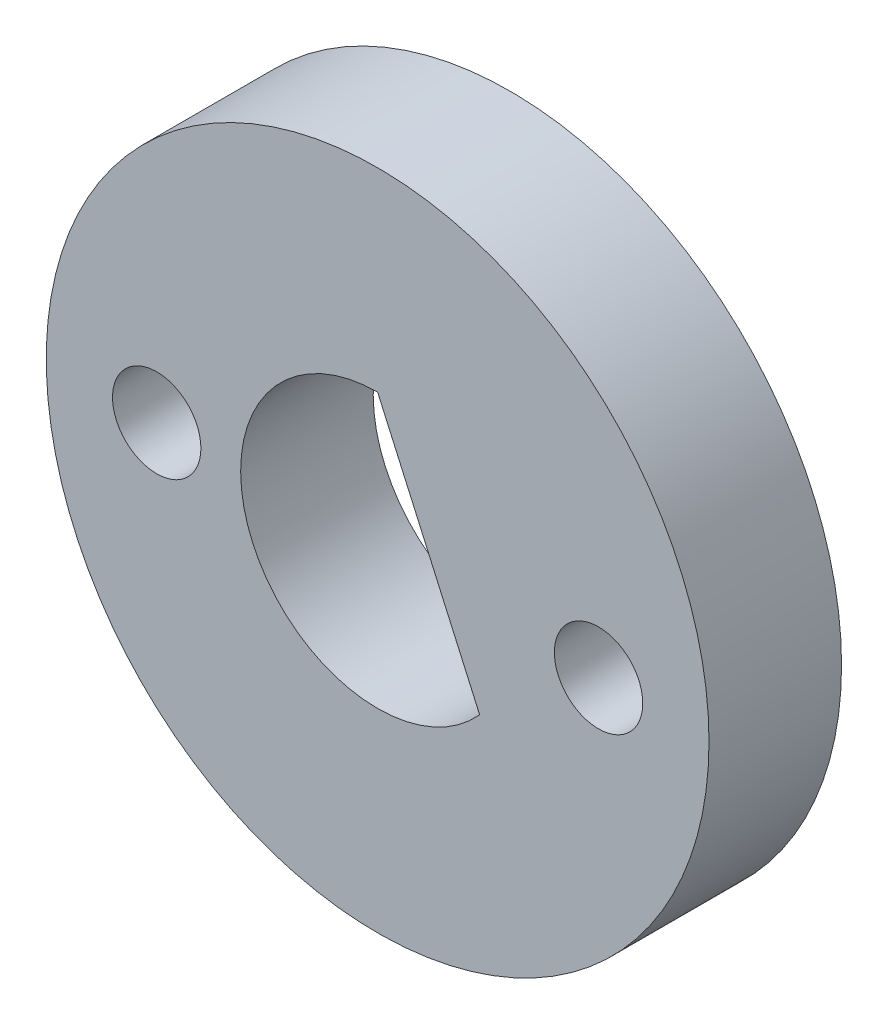
ISO-10303-21;
HEADER;
FILE_DESCRIPTION(('STEP AP214'),'2;1');
FILE_NAME('part.step','',(''),(''),'','','');
FILE_SCHEMA(('AUTOMOTIVE_DESIGN { 1 0 10303 214 1 1 1 1 }'));
ENDSEC;
DATA;
#1=APPLICATION_CONTEXT('core data for automotive mechanical design processes');
#2=APPLICATION_PROTOCOL_DEFINITION('international standard','automotive_design',2000,#1);
#3=PRODUCT_CONTEXT('',#1,'mechanical');
#4=PRODUCT('Part','Part','',(#3));
#5=PRODUCT_RELATED_PRODUCT_CATEGORY('part','',(#4));
#6=PRODUCT_DEFINITION_FORMATION('','',#4);
#7=PRODUCT_DEFINITION_CONTEXT('part definition',#1,'design');
#8=PRODUCT_DEFINITION('design','',#6,#7);
#9=PRODUCT_DEFINITION_SHAPE('','',#8);
#10=(LENGTH_UNIT() NAMED_UNIT(*) SI_UNIT(.MILLI.,.METRE.));
#11=(NAMED_UNIT(*) PLANE_ANGLE_UNIT() SI_UNIT($,.RADIAN.));
#12=(NAMED_UNIT(*) SI_UNIT($,.STERADIAN.) SOLID_ANGLE_UNIT());
#13=UNCERTAINTY_MEASURE_WITH_UNIT(LENGTH_MEASURE(1.E-05),#10,'distance_accuracy_value','');
#14=(GEOMETRIC_REPRESENTATION_CONTEXT(3) GLOBAL_UNCERTAINTY_ASSIGNED_CONTEXT((#13)) GLOBAL_UNIT_ASSIGNED_CONTEXT((#10,
#11,#12)) REPRESENTATION_CONTEXT('',''));
#15=CARTESIAN_POINT('',(0.,0.,0.));
#16=DIRECTION('',(0.,0.,1.));
#17=DIRECTION('',(1.,0.,0.));
#18=AXIS2_PLACEMENT_3D('',#15,#16,#17);
#19=CARTESIAN_POINT('',(0.,0.,3.));
#20=DIRECTION('',(0.,0.,-1.));
#21=DIRECTION('',(-1.,0.,0.));
#22=AXIS2_PLACEMENT_3D('',#19,#20,#21);
#23=CYLINDRICAL_SURFACE('',#22,7.5);
#24=CARTESIAN_POINT('',(0.,0.,3.));
#25=DIRECTION('',(0.,0.,1.));
#26=DIRECTION('',(1.,0.,0.));
#27=AXIS2_PLACEMENT_3D('',#24,#25,#26);
#28=CIRCLE('',#27,7.5);
#29=CARTESIAN_POINT('',(7.5,0.,3.));
#30=VERTEX_POINT('',#29);
#31=EDGE_CURVE('E11',#30,#30,#28,.T.);
#32=ORIENTED_EDGE('',*,*,#31,.F.);
#33=EDGE_LOOP('',(#32));
#34=FACE_BOUND('',#33,.T.);
#35=CARTESIAN_POINT('',(0.,0.,0.));
#36=DIRECTION('',(0.,0.,1.));
#37=DIRECTION('',(1.,0.,0.));
#38=AXIS2_PLACEMENT_3D('',#35,#36,#37);
#39=CIRCLE('',#38,7.5);
#40=CARTESIAN_POINT('',(7.5,0.,0.));
#41=VERTEX_POINT('',#40);
#42=EDGE_CURVE('E36',#41,#41,#39,.T.);
#43=ORIENTED_EDGE('',*,*,#42,.T.);
#44=EDGE_LOOP('',(#43));
#45=FACE_BOUND('',#44,.T.);
#46=ADVANCED_FACE('F33',(#34,#45),#23,.T.);
#47=CARTESIAN_POINT('',(0.,0.,3.));
#48=DIRECTION('',(0.,0.,1.));
#49=DIRECTION('',(1.,0.,0.));
#50=AXIS2_PLACEMENT_3D('',#47,#48,#49);
#51=PLANE('',#50);
#52=CARTESIAN_POINT('',(-5.,0.,3.));
#53=DIRECTION('',(0.,0.,1.));
#54=DIRECTION('',(1.,0.,0.));
#55=AXIS2_PLACEMENT_3D('',#52,#53,#54);
#56=CIRCLE('',#55,0.999999999999989);
#57=CARTESIAN_POINT('',(-4.00000000000001,0.,3.));
#58=VERTEX_POINT('',#57);
#59=EDGE_CURVE('E86',#58,#58,#56,.T.);
#60=ORIENTED_EDGE('',*,*,#59,.F.);
#61=EDGE_LOOP('',(#60));
#62=FACE_BOUND('',#61,.T.);
#63=CARTESIAN_POINT('',(5.,0.,3.));
#64=DIRECTION('',(0.,0.,1.));
#65=DIRECTION('',(1.,0.,0.));
#66=AXIS2_PLACEMENT_3D('',#63,#64,#65);
#67=CIRCLE('',#66,0.999999999999989);
#68=CARTESIAN_POINT('',(5.99999999999999,0.,3.));
#69=VERTEX_POINT('',#68);
#70=EDGE_CURVE('E75',#69,#69,#67,.T.);
#71=ORIENTED_EDGE('',*,*,#70,.F.);
#72=EDGE_LOOP('',(#71));
#73=FACE_BOUND('',#72,.T.);
#74=CARTESIAN_POINT('',(0.,0.,3.));
#75=DIRECTION('',(0.,0.,1.));
#76=DIRECTION('',(1.,0.,0.));
#77=AXIS2_PLACEMENT_3D('',#74,#75,#76);
#78=CIRCLE('',#77,3.1);
#79=CARTESIAN_POINT('',(0.,3.1,3.));
#80=VERTEX_POINT('',#79);
#81=CARTESIAN_POINT('',(2.30885494113047,-2.06862003780718,3.));
#82=VERTEX_POINT('',#81);
#83=EDGE_CURVE('E47',#80,#82,#78,.T.);
#84=ORIENTED_EDGE('',*,*,#83,.F.);
#85=DIRECTION('',(-0.407862239984646,0.91304347826087,0.));
#86=VECTOR('',#85,1.);
#87=CARTESIAN_POINT('',(0.,3.1,3.));
#88=LINE('',#87,#86);
#89=EDGE_CURVE('E66',#82,#80,#88,.T.);
#90=ORIENTED_EDGE('',*,*,#89,.F.);
#91=EDGE_LOOP('',(#84,#90));
#92=FACE_BOUND('',#91,.T.);
#93=ORIENTED_EDGE('',*,*,#31,.T.);
#94=EDGE_LOOP('',(#93));
#95=FACE_BOUND('',#94,.T.);
#96=ADVANCED_FACE('F70',(#62,#73,#92,#95),#51,.T.);
#97=CARTESIAN_POINT('',(0.,0.,0.));
#98=DIRECTION('',(0.,0.,1.));
#99=DIRECTION('',(1.,0.,0.));
#100=AXIS2_PLACEMENT_3D('',#97,#98,#99);
#101=PLANE('',#100);
#102=CARTESIAN_POINT('',(-5.,0.,0.));
#103=DIRECTION('',(0.,0.,1.));
#104=DIRECTION('',(1.,0.,0.));
#105=AXIS2_PLACEMENT_3D('',#102,#103,#104);
#106=CIRCLE('',#105,0.999999999999994);
#107=CARTESIAN_POINT('',(-4.00000000000001,0.,0.));
#108=VERTEX_POINT('',#107);
#109=EDGE_CURVE('E84',#108,#108,#106,.F.);
#110=ORIENTED_EDGE('',*,*,#109,.F.);
#111=EDGE_LOOP('',(#110));
#112=FACE_BOUND('',#111,.T.);
#113=CARTESIAN_POINT('',(5.,0.,0.));
#114=DIRECTION('',(0.,0.,1.));
#115=DIRECTION('',(1.,0.,0.));
#116=AXIS2_PLACEMENT_3D('',#113,#114,#115);
#117=CIRCLE('',#116,0.999999999999994);
#118=CARTESIAN_POINT('',(5.99999999999999,0.,0.));
#119=VERTEX_POINT('',#118);
#120=EDGE_CURVE('E72',#119,#119,#117,.F.);
#121=ORIENTED_EDGE('',*,*,#120,.F.);
#122=EDGE_LOOP('',(#121));
#123=FACE_BOUND('',#122,.T.);
#124=DIRECTION('',(-0.407862239984646,0.91304347826087,0.));
#125=VECTOR('',#124,1.);
#126=CARTESIAN_POINT('',(0.,3.1,0.));
#127=LINE('',#126,#125);
#128=CARTESIAN_POINT('',(2.30885494113047,-2.06862003780718,0.));
#129=VERTEX_POINT('',#128);
#130=CARTESIAN_POINT('',(0.,3.1,0.));
#131=VERTEX_POINT('',#130);
#132=EDGE_CURVE('E78',#129,#131,#127,.T.);
#133=ORIENTED_EDGE('',*,*,#132,.T.);
#134=CARTESIAN_POINT('',(0.,0.,0.));
#135=DIRECTION('',(0.,0.,1.));
#136=DIRECTION('',(1.,0.,0.));
#137=AXIS2_PLACEMENT_3D('',#134,#135,#136);
#138=CIRCLE('',#137,3.1);
#139=EDGE_CURVE('E52',#131,#129,#138,.T.);
#140=ORIENTED_EDGE('',*,*,#139,.T.);
#141=EDGE_LOOP('',(#133,#140));
#142=FACE_BOUND('',#141,.T.);
#143=ORIENTED_EDGE('',*,*,#42,.F.);
#144=EDGE_LOOP('',(#143));
#145=FACE_BOUND('',#144,.T.);
#146=ADVANCED_FACE('F95',(#112,#123,#142,#145),#101,.F.);
#147=CARTESIAN_POINT('',(0.,0.,0.));
#148=DIRECTION('',(0.,0.,1.));
#149=DIRECTION('',(1.,0.,0.));
#150=AXIS2_PLACEMENT_3D('',#147,#148,#149);
#151=CYLINDRICAL_SURFACE('',#150,3.1);
#152=ORIENTED_EDGE('',*,*,#83,.T.);
#153=DIRECTION('',(0.,0.,1.));
#154=VECTOR('',#153,1.);
#155=CARTESIAN_POINT('',(2.30885494113047,-2.06862003780718,0.));
#156=LINE('',#155,#154);
#157=EDGE_CURVE('E63',#129,#82,#156,.T.);
#158=ORIENTED_EDGE('',*,*,#157,.F.);
#159=ORIENTED_EDGE('',*,*,#139,.F.);
#160=DIRECTION('',(0.,0.,1.));
#161=VECTOR('',#160,1.);
#162=CARTESIAN_POINT('',(0.,3.1,0.));
#163=LINE('',#162,#161);
#164=EDGE_CURVE('E57',#131,#80,#163,.T.);
#165=ORIENTED_EDGE('',*,*,#164,.T.);
#166=EDGE_LOOP('',(#152,#158,#159,#165));
#167=FACE_BOUND('',#166,.T.);
#168=ADVANCED_FACE('F59',(#167),#151,.F.);
#169=CARTESIAN_POINT('',(0.,3.1,0.));
#170=DIRECTION('',(0.91304347826087,0.407862239984646,0.));
#171=DIRECTION('',(-0.407862239984646,0.91304347826087,0.));
#172=AXIS2_PLACEMENT_3D('',#169,#170,#171);
#173=PLANE('',#172);
#174=ORIENTED_EDGE('',*,*,#89,.T.);
#175=ORIENTED_EDGE('',*,*,#164,.F.);
#176=ORIENTED_EDGE('',*,*,#132,.F.);
#177=ORIENTED_EDGE('',*,*,#157,.T.);
#178=EDGE_LOOP('',(#174,#175,#176,#177));
#179=FACE_BOUND('',#178,.T.);
#180=ADVANCED_FACE('F67',(#179),#173,.F.);
#181=CARTESIAN_POINT('',(5.,0.,3.));
#182=DIRECTION('',(0.,0.,1.));
#183=DIRECTION('',(1.,0.,0.));
#184=AXIS2_PLACEMENT_3D('',#181,#182,#183);
#185=CYLINDRICAL_SURFACE('',#184,0.999999999999994);
#186=ORIENTED_EDGE('',*,*,#120,.T.);
#187=EDGE_LOOP('',(#186));
#188=FACE_BOUND('',#187,.T.);
#189=ORIENTED_EDGE('',*,*,#70,.T.);
#190=EDGE_LOOP('',(#189));
#191=FACE_BOUND('',#190,.T.);
#192=ADVANCED_FACE('F120',(#188,#191),#185,.F.);
#193=CARTESIAN_POINT('',(-5.,0.,3.));
#194=DIRECTION('',(0.,0.,1.));
#195=DIRECTION('',(1.,0.,0.));
#196=AXIS2_PLACEMENT_3D('',#193,#194,#195);
#197=CYLINDRICAL_SURFACE('',#196,0.999999999999994);
#198=ORIENTED_EDGE('',*,*,#109,.T.);
#199=EDGE_LOOP('',(#198));
#200=FACE_BOUND('',#199,.T.);
#201=ORIENTED_EDGE('',*,*,#59,.T.);
#202=EDGE_LOOP('',(#201));
#203=FACE_BOUND('',#202,.T.);
#204=ADVANCED_FACE('F92',(#200,#203),#197,.F.);
#205=CLOSED_SHELL('',(#46,#96,#146,#168,#180,#192,#204));
#206=MANIFOLD_SOLID_BREP('B2',#205);
#207=ADVANCED_BREP_SHAPE_REPRESENTATION('',(#18,#206),#14);
#208=SHAPE_DEFINITION_REPRESENTATION(#9,#207);
ENDSEC;
END-ISO-10303-21;
